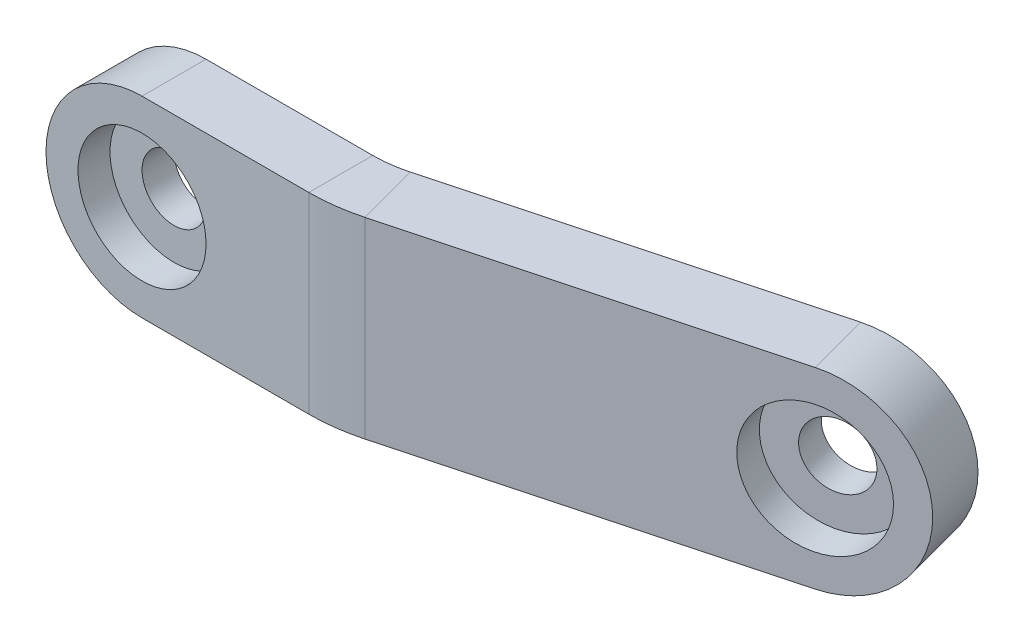
ISO-10303-21;
HEADER;
FILE_DESCRIPTION(('STEP AP214'),'2;1');
FILE_NAME('part.step','',(''),(''),'','','');
FILE_SCHEMA(('AUTOMOTIVE_DESIGN { 1 0 10303 214 1 1 1 1 }'));
ENDSEC;
DATA;
#1=APPLICATION_CONTEXT('core data for automotive mechanical design processes');
#2=APPLICATION_PROTOCOL_DEFINITION('international standard','automotive_design',2000,#1);
#3=PRODUCT_CONTEXT('',#1,'mechanical');
#4=PRODUCT('Part','Part','',(#3));
#5=PRODUCT_RELATED_PRODUCT_CATEGORY('part','',(#4));
#6=PRODUCT_DEFINITION_FORMATION('','',#4);
#7=PRODUCT_DEFINITION_CONTEXT('part definition',#1,'design');
#8=PRODUCT_DEFINITION('design','',#6,#7);
#9=PRODUCT_DEFINITION_SHAPE('','',#8);
#10=(LENGTH_UNIT() NAMED_UNIT(*) SI_UNIT(.MILLI.,.METRE.));
#11=(NAMED_UNIT(*) PLANE_ANGLE_UNIT() SI_UNIT($,.RADIAN.));
#12=(NAMED_UNIT(*) SI_UNIT($,.STERADIAN.) SOLID_ANGLE_UNIT());
#13=UNCERTAINTY_MEASURE_WITH_UNIT(LENGTH_MEASURE(1.E-05),#10,'distance_accuracy_value','');
#14=(GEOMETRIC_REPRESENTATION_CONTEXT(3) GLOBAL_UNCERTAINTY_ASSIGNED_CONTEXT((#13)) GLOBAL_UNIT_ASSIGNED_CONTEXT((#10,
#11,#12)) REPRESENTATION_CONTEXT('',''));
#15=CARTESIAN_POINT('',(0.,0.,0.));
#16=DIRECTION('',(0.,0.,1.));
#17=DIRECTION('',(1.,0.,0.));
#18=AXIS2_PLACEMENT_3D('',#15,#16,#17);
#19=CARTESIAN_POINT('',(19.2847768432247,0.,-13.5649973091008));
#20=DIRECTION('',(0.258819045102521,0.,0.965925826289068));
#21=DIRECTION('',(0.965925826289068,0.,-0.258819045102521));
#22=AXIS2_PLACEMENT_3D('',#19,#20,#21);
#23=CYLINDRICAL_SURFACE('',#22,2.5);
#24=CARTESIAN_POINT('',(20.8376911138399,0.,-7.76944235136641));
#25=DIRECTION('',(0.258819045102521,0.,0.965925826289068));
#26=DIRECTION('',(0.965925826289068,0.,-0.258819045102521));
#27=AXIS2_PLACEMENT_3D('',#24,#25,#26);
#28=CIRCLE('',#27,2.5);
#29=CARTESIAN_POINT('',(23.2525056795625,0.,-8.41648996412272));
#30=VERTEX_POINT('',#29);
#31=EDGE_CURVE('E206',#30,#30,#28,.T.);
#32=ORIENTED_EDGE('',*,*,#31,.F.);
#33=EDGE_LOOP('',(#32));
#34=FACE_BOUND('',#33,.T.);
#35=CARTESIAN_POINT('',(21.4847387265962,0.,-5.35462778564374));
#36=DIRECTION('',(0.258819045102521,0.,0.965925826289068));
#37=DIRECTION('',(0.965925826289068,0.,-0.258819045102521));
#38=AXIS2_PLACEMENT_3D('',#35,#36,#37);
#39=CIRCLE('',#38,2.5);
#40=CARTESIAN_POINT('',(23.8995532923188,0.,-6.00167539840004));
#41=VERTEX_POINT('',#40);
#42=EDGE_CURVE('E48',#41,#41,#39,.F.);
#43=ORIENTED_EDGE('',*,*,#42,.F.);
#44=EDGE_LOOP('',(#43));
#45=FACE_BOUND('',#44,.T.);
#46=ADVANCED_FACE('F44',(#34,#45),#23,.F.);
#47=CARTESIAN_POINT('',(-22.5,0.,-9.71058518963533));
#48=DIRECTION('',(0.,0.,1.));
#49=DIRECTION('',(1.,0.,0.));
#50=AXIS2_PLACEMENT_3D('',#47,#48,#49);
#51=CYLINDRICAL_SURFACE('',#50,2.5);
#52=CARTESIAN_POINT('',(-22.5,0.,0.));
#53=DIRECTION('',(0.,0.,1.));
#54=DIRECTION('',(1.,0.,0.));
#55=AXIS2_PLACEMENT_3D('',#52,#53,#54);
#56=CIRCLE('',#55,2.5);
#57=CARTESIAN_POINT('',(-20.,0.,0.));
#58=VERTEX_POINT('',#57);
#59=EDGE_CURVE('E193',#58,#58,#56,.T.);
#60=CARTESIAN_POINT('',(-22.5,0.,2.5));
#61=DIRECTION('',(0.,0.,1.));
#62=DIRECTION('',(1.,0.,0.));
#63=AXIS2_PLACEMENT_3D('',#60,#61,#62);
#64=CIRCLE('',#63,2.5);
#65=CARTESIAN_POINT('',(-20.,0.,2.5));
#66=VERTEX_POINT('',#65);
#67=EDGE_CURVE('E195',#66,#66,#64,.F.);
#68=CARTESIAN_POINT('',(-20.,0.,0.));
#69=CARTESIAN_POINT('',(-20.,0.,0.026041666666665));
#70=CARTESIAN_POINT('',(-20.,0.,0.0520833333333316));
#71=CARTESIAN_POINT('',(-20.,0.,0.104166666666665));
#72=CARTESIAN_POINT('',(-20.,0.,0.130208333333332));
#73=CARTESIAN_POINT('',(-20.,0.,0.182291666666665));
#74=CARTESIAN_POINT('',(-20.,0.,0.208333333333332));
#75=CARTESIAN_POINT('',(-20.,0.,0.260416666666665));
#76=CARTESIAN_POINT('',(-20.,0.,0.286458333333332));
#77=CARTESIAN_POINT('',(-20.,0.,0.338541666666665));
#78=CARTESIAN_POINT('',(-20.,0.,0.364583333333332));
#79=CARTESIAN_POINT('',(-20.,0.,0.416666666666665));
#80=CARTESIAN_POINT('',(-20.,0.,0.442708333333332));
#81=CARTESIAN_POINT('',(-20.,0.,0.494791666666665));
#82=CARTESIAN_POINT('',(-20.,0.,0.520833333333332));
#83=CARTESIAN_POINT('',(-20.,0.,0.572916666666666));
#84=CARTESIAN_POINT('',(-20.,0.,0.598958333333332));
#85=CARTESIAN_POINT('',(-20.,0.,0.651041666666666));
#86=CARTESIAN_POINT('',(-20.,0.,0.677083333333332));
#87=CARTESIAN_POINT('',(-20.,0.,0.729166666666666));
#88=CARTESIAN_POINT('',(-20.,0.,0.755208333333332));
#89=CARTESIAN_POINT('',(-20.,0.,0.807291666666666));
#90=CARTESIAN_POINT('',(-20.,0.,0.833333333333332));
#91=CARTESIAN_POINT('',(-20.,0.,0.885416666666666));
#92=CARTESIAN_POINT('',(-20.,0.,0.911458333333332));
#93=CARTESIAN_POINT('',(-20.,0.,0.963541666666666));
#94=CARTESIAN_POINT('',(-20.,0.,0.989583333333333));
#95=CARTESIAN_POINT('',(-20.,0.,1.04166666666667));
#96=CARTESIAN_POINT('',(-20.,0.,1.06770833333333));
#97=CARTESIAN_POINT('',(-20.,0.,1.11979166666667));
#98=CARTESIAN_POINT('',(-20.,0.,1.14583333333333));
#99=CARTESIAN_POINT('',(-20.,0.,1.19791666666667));
#100=CARTESIAN_POINT('',(-20.,0.,1.22395833333333));
#101=CARTESIAN_POINT('',(-20.,0.,1.27604166666667));
#102=CARTESIAN_POINT('',(-20.,0.,1.30208333333333));
#103=CARTESIAN_POINT('',(-20.,0.,1.35416666666667));
#104=CARTESIAN_POINT('',(-20.,0.,1.38020833333333));
#105=CARTESIAN_POINT('',(-20.,0.,1.43229166666667));
#106=CARTESIAN_POINT('',(-20.,0.,1.45833333333333));
#107=CARTESIAN_POINT('',(-20.,0.,1.51041666666667));
#108=CARTESIAN_POINT('',(-20.,0.,1.53645833333333));
#109=CARTESIAN_POINT('',(-20.,0.,1.58854166666667));
#110=CARTESIAN_POINT('',(-20.,0.,1.61458333333333));
#111=CARTESIAN_POINT('',(-20.,0.,1.66666666666667));
#112=CARTESIAN_POINT('',(-20.,0.,1.69270833333333));
#113=CARTESIAN_POINT('',(-20.,0.,1.74479166666667));
#114=CARTESIAN_POINT('',(-20.,0.,1.77083333333333));
#115=CARTESIAN_POINT('',(-20.,0.,1.82291666666667));
#116=CARTESIAN_POINT('',(-20.,0.,1.84895833333333));
#117=CARTESIAN_POINT('',(-20.,0.,1.90104166666667));
#118=CARTESIAN_POINT('',(-20.,0.,1.92708333333333));
#119=CARTESIAN_POINT('',(-20.,0.,1.97916666666667));
#120=CARTESIAN_POINT('',(-20.,0.,2.00520833333333));
#121=CARTESIAN_POINT('',(-20.,0.,2.05729166666667));
#122=CARTESIAN_POINT('',(-20.,0.,2.08333333333333));
#123=CARTESIAN_POINT('',(-20.,0.,2.13541666666667));
#124=CARTESIAN_POINT('',(-20.,0.,2.16145833333333));
#125=CARTESIAN_POINT('',(-20.,0.,2.21354166666667));
#126=CARTESIAN_POINT('',(-20.,0.,2.23958333333333));
#127=CARTESIAN_POINT('',(-20.,0.,2.29166666666667));
#128=CARTESIAN_POINT('',(-20.,0.,2.31770833333333));
#129=CARTESIAN_POINT('',(-20.,0.,2.36979166666667));
#130=CARTESIAN_POINT('',(-20.,0.,2.39583333333333));
#131=CARTESIAN_POINT('',(-20.,0.,2.44791666666667));
#132=CARTESIAN_POINT('',(-20.,0.,2.47395833333333));
#133=CARTESIAN_POINT('',(-20.,0.,2.5));
#134=B_SPLINE_CURVE_WITH_KNOTS('',3,(#68,#69,#70,#71,#72,#73,#74,#75,#76,#77,#78,#79,#80,#81,
#82,#83,#84,#85,#86,#87,#88,#89,#90,#91,#92,#93,#94,#95,#96,#97,#98,#99,#100,#101,#102,#103,
#104,#105,#106,#107,#108,#109,#110,#111,#112,#113,#114,#115,#116,#117,#118,#119,#120,#121,#122,
#123,#124,#125,#126,#127,#128,#129,#130,#131,#132,#133),.UNSPECIFIED.,.F.,.F.,(4,2,2,2,2,2,2,2,
2,2,2,2,2,2,2,2,2,2,2,2,2,2,2,2,2,2,2,2,2,2,2,2,4),(0.,0.0781250000000001,0.15625,0.234375,
0.3125,0.390625,0.46875,0.546875,0.625000000000001,0.703125000000001,0.781250000000001,
0.859375000000001,0.937500000000001,1.015625,1.09375,1.171875,1.25,1.328125,1.40625,1.484375,
1.5625,1.640625,1.71875,1.796875,1.875,1.953125,2.03125,2.109375,2.1875,2.265625,2.34375,
2.421875,2.5),.UNSPECIFIED.);
#135=EDGE_CURVE('BSEAM237',#58,#66,#134,.T.);
#136=ORIENTED_EDGE('',*,*,#59,.F.);
#137=ORIENTED_EDGE('',*,*,#67,.F.);
#138=ORIENTED_EDGE('',*,*,#135,.T.);
#139=ORIENTED_EDGE('',*,*,#135,.F.);
#140=EDGE_LOOP('',(#136,#138,#137,#139));
#141=FACE_BOUND('',#140,.T.);
#142=ADVANCED_FACE('F237',(#141),#51,.F.);
#143=CARTESIAN_POINT('',(-0.895639977664165,0.,-1.94601383655968));
#144=DIRECTION('',(0.258819045102521,0.,0.965925826289068));
#145=DIRECTION('',(0.965925826289068,0.,-0.258819045102521));
#146=AXIS2_PLACEMENT_3D('',#143,#144,#145);
#147=PLANE('',#146);
#148=ORIENTED_EDGE('',*,*,#31,.T.);
#149=EDGE_LOOP('',(#148));
#150=FACE_BOUND('',#149,.T.);
#151=DIRECTION('',(0.965925826289068,0.,-0.258819045102521));
#152=VECTOR('',#151,1.);
#153=CARTESIAN_POINT('',(-0.895639977664165,-7.50000000000001,-1.94601383655968));
#154=LINE('',#153,#152);
#155=CARTESIAN_POINT('',(-6.88659701278567,-7.50000000000001,-0.340741737109316));
#156=VERTEX_POINT('',#155);
#157=CARTESIAN_POINT('',(20.8376911138399,-7.5,-7.76944235136641));
#158=VERTEX_POINT('',#157);
#159=EDGE_CURVE('E61',#156,#158,#154,.T.);
#160=ORIENTED_EDGE('',*,*,#159,.F.);
#161=DIRECTION('',(0.,1.,0.));
#162=VECTOR('',#161,1.);
#163=CARTESIAN_POINT('',(-6.88659701278567,0.,-0.340741737109316));
#164=LINE('',#163,#162);
#165=CARTESIAN_POINT('',(-6.88659701278567,7.50000000000001,-0.340741737109316));
#166=VERTEX_POINT('',#165);
#167=EDGE_CURVE('E53',#156,#166,#164,.T.);
#168=ORIENTED_EDGE('',*,*,#167,.T.);
#169=DIRECTION('',(0.965925826289068,0.,-0.258819045102521));
#170=VECTOR('',#169,1.);
#171=CARTESIAN_POINT('',(-0.895639977664165,7.50000000000001,-1.94601383655968));
#172=LINE('',#171,#170);
#173=CARTESIAN_POINT('',(20.8376911138399,7.50000000000002,-7.76944235136641));
#174=VERTEX_POINT('',#173);
#175=EDGE_CURVE('E69',#166,#174,#172,.T.);
#176=ORIENTED_EDGE('',*,*,#175,.T.);
#177=CARTESIAN_POINT('',(20.8376911138399,0.,-7.76944235136641));
#178=DIRECTION('',(0.258819045102521,0.,0.965925826289068));
#179=DIRECTION('',(0.965925826289068,0.,-0.258819045102521));
#180=AXIS2_PLACEMENT_3D('',#177,#178,#179);
#181=CIRCLE('',#180,7.50000000000001);
#182=EDGE_CURVE('E147',#158,#174,#181,.T.);
#183=ORIENTED_EDGE('',*,*,#182,.F.);
#184=EDGE_LOOP('',(#160,#168,#176,#183));
#185=FACE_BOUND('',#184,.T.);
#186=ADVANCED_FACE('F217',(#150,#185),#147,.F.);
#187=CARTESIAN_POINT('',(0.39845524784844,7.50000000000001,2.88361529488566));
#188=DIRECTION('',(0.,-1.,0.));
#189=DIRECTION('',(0.965925826289068,0.,-0.258819045102521));
#190=AXIS2_PLACEMENT_3D('',#187,#188,#189);
#191=PLANE('',#190);
#192=DIRECTION('',(-0.258819045102521,0.,-0.965925826289068));
#193=VECTOR('',#192,1.);
#194=CARTESIAN_POINT('',(-5.59250178727307,7.50000000000001,4.48888739433603));
#195=LINE('',#194,#193);
#196=CARTESIAN_POINT('',(-5.59250178727307,7.50000000000001,4.48888739433602));
#197=VERTEX_POINT('',#196);
#198=EDGE_CURVE('E186',#197,#166,#195,.T.);
#199=ORIENTED_EDGE('',*,*,#198,.F.);
#200=DIRECTION('',(0.965925826289068,0.,-0.258819045102521));
#201=VECTOR('',#200,1.);
#202=CARTESIAN_POINT('',(0.39845524784844,7.50000000000001,2.88361529488566));
#203=LINE('',#202,#201);
#204=CARTESIAN_POINT('',(22.1317863393525,7.50000000000002,-2.93981321992107));
#205=VERTEX_POINT('',#204);
#206=EDGE_CURVE('E174',#197,#205,#203,.T.);
#207=ORIENTED_EDGE('',*,*,#206,.T.);
#208=DIRECTION('',(0.258819045102521,0.,0.965925826289068));
#209=VECTOR('',#208,1.);
#210=CARTESIAN_POINT('',(22.1317863393525,7.50000000000002,-2.93981321992107));
#211=LINE('',#210,#209);
#212=EDGE_CURVE('E178',#174,#205,#211,.T.);
#213=ORIENTED_EDGE('',*,*,#212,.F.);
#214=ORIENTED_EDGE('',*,*,#175,.F.);
#215=EDGE_LOOP('',(#199,#207,#213,#214));
#216=FACE_BOUND('',#215,.T.);
#217=ADVANCED_FACE('F220',(#216),#191,.F.);
#218=CARTESIAN_POINT('',(0.398455247848443,-7.5,2.88361529488566));
#219=DIRECTION('',(0.,-1.,0.));
#220=DIRECTION('',(0.965925826289068,0.,-0.258819045102521));
#221=AXIS2_PLACEMENT_3D('',#218,#219,#220);
#222=PLANE('',#221);
#223=DIRECTION('',(0.258819045102521,0.,0.965925826289068));
#224=VECTOR('',#223,1.);
#225=CARTESIAN_POINT('',(-5.59250178727307,-7.50000000000001,4.48888739433602));
#226=LINE('',#225,#224);
#227=CARTESIAN_POINT('',(-5.59250178727307,-7.50000000000001,4.48888739433603));
#228=VERTEX_POINT('',#227);
#229=EDGE_CURVE('E12',#156,#228,#226,.T.);
#230=ORIENTED_EDGE('',*,*,#229,.F.);
#231=ORIENTED_EDGE('',*,*,#159,.T.);
#232=DIRECTION('',(0.258819045102521,0.,0.965925826289068));
#233=VECTOR('',#232,1.);
#234=CARTESIAN_POINT('',(22.1317863393525,-7.5,-2.93981321992107));
#235=LINE('',#234,#233);
#236=CARTESIAN_POINT('',(22.1317863393525,-7.5,-2.93981321992107));
#237=VERTEX_POINT('',#236);
#238=EDGE_CURVE('E182',#158,#237,#235,.T.);
#239=ORIENTED_EDGE('',*,*,#238,.T.);
#240=DIRECTION('',(0.965925826289068,0.,-0.258819045102521));
#241=VECTOR('',#240,1.);
#242=CARTESIAN_POINT('',(0.398455247848443,-7.5,2.88361529488566));
#243=LINE('',#242,#241);
#244=EDGE_CURVE('E175',#228,#237,#243,.T.);
#245=ORIENTED_EDGE('',*,*,#244,.F.);
#246=EDGE_LOOP('',(#230,#231,#239,#245));
#247=FACE_BOUND('',#246,.T.);
#248=ADVANCED_FACE('F46',(#247),#222,.T.);
#249=CARTESIAN_POINT('',(22.1317863393525,0.,-2.93981321992107));
#250=DIRECTION('',(0.258819045102521,0.,0.965925826289068));
#251=DIRECTION('',(0.965925826289068,0.,-0.258819045102521));
#252=AXIS2_PLACEMENT_3D('',#249,#250,#251);
#253=CYLINDRICAL_SURFACE('',#252,7.50000000000001);
#254=ORIENTED_EDGE('',*,*,#182,.T.);
#255=ORIENTED_EDGE('',*,*,#212,.T.);
#256=CARTESIAN_POINT('',(22.1317863393525,0.,-2.93981321992107));
#257=DIRECTION('',(0.258819045102521,0.,0.965925826289068));
#258=DIRECTION('',(0.965925826289068,0.,-0.258819045102521));
#259=AXIS2_PLACEMENT_3D('',#256,#257,#258);
#260=CIRCLE('',#259,7.50000000000001);
#261=EDGE_CURVE('E171',#237,#205,#260,.T.);
#262=ORIENTED_EDGE('',*,*,#261,.F.);
#263=ORIENTED_EDGE('',*,*,#238,.F.);
#264=EDGE_LOOP('',(#254,#255,#262,#263));
#265=FACE_BOUND('',#264,.T.);
#266=ADVANCED_FACE('F227',(#265),#253,.T.);
#267=CARTESIAN_POINT('',(0.398455247848442,0.,2.88361529488566));
#268=DIRECTION('',(0.258819045102521,0.,0.965925826289068));
#269=DIRECTION('',(0.965925826289068,0.,-0.258819045102521));
#270=AXIS2_PLACEMENT_3D('',#267,#268,#269);
#271=PLANE('',#270);
#272=CARTESIAN_POINT('',(22.1317863393525,0.,-2.93981321992107));
#273=DIRECTION('',(0.258819045102521,0.,0.965925826289068));
#274=DIRECTION('',(0.965925826289068,0.,-0.258819045102521));
#275=AXIS2_PLACEMENT_3D('',#272,#273,#274);
#276=CIRCLE('',#275,5.);
#277=CARTESIAN_POINT('',(26.9614154707978,0.,-4.23390844543368));
#278=VERTEX_POINT('',#277);
#279=EDGE_CURVE('E296',#278,#278,#276,.T.);
#280=ORIENTED_EDGE('',*,*,#279,.F.);
#281=EDGE_LOOP('',(#280));
#282=FACE_BOUND('',#281,.T.);
#283=DIRECTION('',(0.,1.,0.));
#284=VECTOR('',#283,1.);
#285=CARTESIAN_POINT('',(-5.59250178727307,0.,4.48888739433603));
#286=LINE('',#285,#284);
#287=EDGE_CURVE('E181',#228,#197,#286,.T.);
#288=ORIENTED_EDGE('',*,*,#287,.F.);
#289=ORIENTED_EDGE('',*,*,#244,.T.);
#290=ORIENTED_EDGE('',*,*,#261,.T.);
#291=ORIENTED_EDGE('',*,*,#206,.F.);
#292=EDGE_LOOP('',(#288,#289,#290,#291));
#293=FACE_BOUND('',#292,.T.);
#294=ADVANCED_FACE('F222',(#282,#293),#271,.T.);
#295=CARTESIAN_POINT('',(-22.5,0.,5.));
#296=DIRECTION('',(0.,0.,1.));
#297=DIRECTION('',(1.,0.,0.));
#298=AXIS2_PLACEMENT_3D('',#295,#296,#297);
#299=CYLINDRICAL_SURFACE('',#298,7.50000000000001);
#300=DIRECTION('',(0.,0.,1.));
#301=VECTOR('',#300,1.);
#302=CARTESIAN_POINT('',(-22.5,7.50000000000001,5.));
#303=LINE('',#302,#301);
#304=CARTESIAN_POINT('',(-22.5,7.50000000000001,0.));
#305=VERTEX_POINT('',#304);
#306=CARTESIAN_POINT('',(-22.5,7.50000000000001,5.));
#307=VERTEX_POINT('',#306);
#308=EDGE_CURVE('E157',#305,#307,#303,.T.);
#309=ORIENTED_EDGE('',*,*,#308,.F.);
#310=CARTESIAN_POINT('',(-22.5,0.,0.));
#311=DIRECTION('',(0.,0.,1.));
#312=DIRECTION('',(1.,0.,0.));
#313=AXIS2_PLACEMENT_3D('',#310,#311,#312);
#314=CIRCLE('',#313,7.50000000000001);
#315=CARTESIAN_POINT('',(-22.5,-7.50000000000001,0.));
#316=VERTEX_POINT('',#315);
#317=EDGE_CURVE('E166',#305,#316,#314,.T.);
#318=ORIENTED_EDGE('',*,*,#317,.T.);
#319=DIRECTION('',(0.,0.,1.));
#320=VECTOR('',#319,1.);
#321=CARTESIAN_POINT('',(-22.5,-7.50000000000001,5.));
#322=LINE('',#321,#320);
#323=CARTESIAN_POINT('',(-22.5,-7.50000000000001,5.));
#324=VERTEX_POINT('',#323);
#325=EDGE_CURVE('E139',#316,#324,#322,.T.);
#326=ORIENTED_EDGE('',*,*,#325,.T.);
#327=CARTESIAN_POINT('',(-22.5,0.,5.));
#328=DIRECTION('',(0.,0.,1.));
#329=DIRECTION('',(1.,0.,0.));
#330=AXIS2_PLACEMENT_3D('',#327,#328,#329);
#331=CIRCLE('',#330,7.50000000000001);
#332=EDGE_CURVE('E131',#307,#324,#331,.T.);
#333=ORIENTED_EDGE('',*,*,#332,.F.);
#334=EDGE_LOOP('',(#309,#318,#326,#333));
#335=FACE_BOUND('',#334,.T.);
#336=ADVANCED_FACE('F267',(#335),#299,.T.);
#337=CARTESIAN_POINT('',(0.,0.,5.));
#338=DIRECTION('',(0.,0.,1.));
#339=DIRECTION('',(1.,0.,0.));
#340=AXIS2_PLACEMENT_3D('',#337,#338,#339);
#341=PLANE('',#340);
#342=CARTESIAN_POINT('',(-22.5,0.,5.));
#343=DIRECTION('',(0.,0.,1.));
#344=DIRECTION('',(1.,0.,0.));
#345=AXIS2_PLACEMENT_3D('',#342,#343,#344);
#346=CIRCLE('',#345,5.);
#347=CARTESIAN_POINT('',(-17.5,0.,5.));
#348=VERTEX_POINT('',#347);
#349=EDGE_CURVE('E201',#348,#348,#346,.T.);
#350=ORIENTED_EDGE('',*,*,#349,.F.);
#351=EDGE_LOOP('',(#350));
#352=FACE_BOUND('',#351,.T.);
#353=DIRECTION('',(1.,0.,0.));
#354=VECTOR('',#353,1.);
#355=CARTESIAN_POINT('',(0.,-7.50000000000001,5.));
#356=LINE('',#355,#354);
#357=CARTESIAN_POINT('',(-9.47478746381089,-7.50000000000001,5.));
#358=VERTEX_POINT('',#357);
#359=EDGE_CURVE('E132',#324,#358,#356,.T.);
#360=ORIENTED_EDGE('',*,*,#359,.T.);
#361=DIRECTION('',(0.,1.,0.));
#362=VECTOR('',#361,1.);
#363=CARTESIAN_POINT('',(-9.47478746381089,0.,5.));
#364=LINE('',#363,#362);
#365=CARTESIAN_POINT('',(-9.47478746381089,7.50000000000001,5.));
#366=VERTEX_POINT('',#365);
#367=EDGE_CURVE('E124',#358,#366,#364,.T.);
#368=ORIENTED_EDGE('',*,*,#367,.T.);
#369=DIRECTION('',(1.,0.,0.));
#370=VECTOR('',#369,1.);
#371=CARTESIAN_POINT('',(0.,7.50000000000001,5.));
#372=LINE('',#371,#370);
#373=EDGE_CURVE('E162',#307,#366,#372,.T.);
#374=ORIENTED_EDGE('',*,*,#373,.F.);
#375=ORIENTED_EDGE('',*,*,#332,.T.);
#376=EDGE_LOOP('',(#360,#368,#374,#375));
#377=FACE_BOUND('',#376,.T.);
#378=ADVANCED_FACE('F136',(#352,#377),#341,.T.);
#379=CARTESIAN_POINT('',(0.,7.50000000000001,5.));
#380=DIRECTION('',(0.,-1.,0.));
#381=DIRECTION('',(1.,0.,0.));
#382=AXIS2_PLACEMENT_3D('',#379,#380,#381);
#383=PLANE('',#382);
#384=ORIENTED_EDGE('',*,*,#373,.T.);
#385=DIRECTION('',(0.,0.,-1.));
#386=VECTOR('',#385,1.);
#387=CARTESIAN_POINT('',(-9.47478746381089,7.50000000000001,5.));
#388=LINE('',#387,#386);
#389=CARTESIAN_POINT('',(-9.47478746381089,7.50000000000001,0.));
#390=VERTEX_POINT('',#389);
#391=EDGE_CURVE('E159',#366,#390,#388,.T.);
#392=ORIENTED_EDGE('',*,*,#391,.T.);
#393=DIRECTION('',(1.,0.,0.));
#394=VECTOR('',#393,1.);
#395=CARTESIAN_POINT('',(0.,7.50000000000001,0.));
#396=LINE('',#395,#394);
#397=EDGE_CURVE('E149',#305,#390,#396,.T.);
#398=ORIENTED_EDGE('',*,*,#397,.F.);
#399=ORIENTED_EDGE('',*,*,#308,.T.);
#400=EDGE_LOOP('',(#384,#392,#398,#399));
#401=FACE_BOUND('',#400,.T.);
#402=ADVANCED_FACE('F273',(#401),#383,.F.);
#403=CARTESIAN_POINT('',(0.,0.,0.));
#404=DIRECTION('',(0.,0.,1.));
#405=DIRECTION('',(1.,0.,0.));
#406=AXIS2_PLACEMENT_3D('',#403,#404,#405);
#407=PLANE('',#406);
#408=ORIENTED_EDGE('',*,*,#59,.T.);
#409=EDGE_LOOP('',(#408));
#410=FACE_BOUND('',#409,.T.);
#411=DIRECTION('',(0.,1.,0.));
#412=VECTOR('',#411,1.);
#413=CARTESIAN_POINT('',(-9.47478746381089,0.,0.));
#414=LINE('',#413,#412);
#415=CARTESIAN_POINT('',(-9.47478746381089,-7.50000000000001,0.));
#416=VERTEX_POINT('',#415);
#417=EDGE_CURVE('E169',#416,#390,#414,.T.);
#418=ORIENTED_EDGE('',*,*,#417,.F.);
#419=DIRECTION('',(1.,0.,0.));
#420=VECTOR('',#419,1.);
#421=CARTESIAN_POINT('',(0.,-7.50000000000001,0.));
#422=LINE('',#421,#420);
#423=EDGE_CURVE('E144',#316,#416,#422,.T.);
#424=ORIENTED_EDGE('',*,*,#423,.F.);
#425=ORIENTED_EDGE('',*,*,#317,.F.);
#426=ORIENTED_EDGE('',*,*,#397,.T.);
#427=EDGE_LOOP('',(#418,#424,#425,#426));
#428=FACE_BOUND('',#427,.T.);
#429=ADVANCED_FACE('F277',(#410,#428),#407,.F.);
#430=CARTESIAN_POINT('',(0.,-7.50000000000001,5.));
#431=DIRECTION('',(0.,-1.,0.));
#432=DIRECTION('',(1.,0.,0.));
#433=AXIS2_PLACEMENT_3D('',#430,#431,#432);
#434=PLANE('',#433);
#435=ORIENTED_EDGE('',*,*,#423,.T.);
#436=DIRECTION('',(0.,0.,1.));
#437=VECTOR('',#436,1.);
#438=CARTESIAN_POINT('',(-9.47478746381089,-7.50000000000001,5.));
#439=LINE('',#438,#437);
#440=EDGE_CURVE('E115',#416,#358,#439,.T.);
#441=ORIENTED_EDGE('',*,*,#440,.T.);
#442=ORIENTED_EDGE('',*,*,#359,.F.);
#443=ORIENTED_EDGE('',*,*,#325,.F.);
#444=EDGE_LOOP('',(#435,#441,#442,#443));
#445=FACE_BOUND('',#444,.T.);
#446=ADVANCED_FACE('F142',(#445),#434,.T.);
#447=CARTESIAN_POINT('',(-9.47478746381089,-7.50000000000001,-10.));
#448=DIRECTION('',(0.,-1.,0.));
#449=DIRECTION('',(0.,0.,-1.));
#450=AXIS2_PLACEMENT_3D('',#447,#448,#449);
#451=PLANE('',#450);
#452=ORIENTED_EDGE('',*,*,#440,.F.);
#453=CARTESIAN_POINT('',(-9.47478746381089,-7.50000000000001,-10.));
#454=DIRECTION('',(0.,1.,0.));
#455=DIRECTION('',(-1.,0.,0.));
#456=AXIS2_PLACEMENT_3D('',#453,#454,#455);
#457=CIRCLE('',#456,10.);
#458=EDGE_CURVE('E152',#416,#156,#457,.T.);
#459=ORIENTED_EDGE('',*,*,#458,.T.);
#460=ORIENTED_EDGE('',*,*,#229,.T.);
#461=CARTESIAN_POINT('',(-9.47478746381089,-7.50000000000001,-10.));
#462=DIRECTION('',(0.,1.,0.));
#463=DIRECTION('',(0.,0.,1.));
#464=AXIS2_PLACEMENT_3D('',#461,#462,#463);
#465=CIRCLE('',#464,15.);
#466=EDGE_CURVE('E110',#358,#228,#465,.T.);
#467=ORIENTED_EDGE('',*,*,#466,.F.);
#468=EDGE_LOOP('',(#452,#459,#460,#467));
#469=FACE_BOUND('',#468,.T.);
#470=ADVANCED_FACE('F112',(#469),#451,.T.);
#471=CARTESIAN_POINT('',(-9.47478746381089,7.50000000000001,-10.));
#472=DIRECTION('',(0.,1.,0.));
#473=DIRECTION('',(0.,0.,1.));
#474=AXIS2_PLACEMENT_3D('',#471,#472,#473);
#475=PLANE('',#474);
#476=ORIENTED_EDGE('',*,*,#198,.T.);
#477=CARTESIAN_POINT('',(-9.47478746381089,7.50000000000001,-10.));
#478=DIRECTION('',(0.,1.,0.));
#479=DIRECTION('',(-1.,0.,0.));
#480=AXIS2_PLACEMENT_3D('',#477,#478,#479);
#481=CIRCLE('',#480,10.);
#482=EDGE_CURVE('E120',#166,#390,#481,.F.);
#483=ORIENTED_EDGE('',*,*,#482,.T.);
#484=ORIENTED_EDGE('',*,*,#391,.F.);
#485=CARTESIAN_POINT('',(-9.47478746381089,7.50000000000001,-10.));
#486=DIRECTION('',(0.,-1.,0.));
#487=DIRECTION('',(0.,0.,1.));
#488=AXIS2_PLACEMENT_3D('',#485,#486,#487);
#489=CIRCLE('',#488,15.);
#490=EDGE_CURVE('E119',#197,#366,#489,.T.);
#491=ORIENTED_EDGE('',*,*,#490,.F.);
#492=EDGE_LOOP('',(#476,#483,#484,#491));
#493=FACE_BOUND('',#492,.T.);
#494=ADVANCED_FACE('F218',(#493),#475,.T.);
#495=CARTESIAN_POINT('',(-9.47478746381089,-16.146492069932,-10.));
#496=DIRECTION('',(0.,1.,0.));
#497=DIRECTION('',(-1.,0.,0.));
#498=AXIS2_PLACEMENT_3D('',#495,#496,#497);
#499=CYLINDRICAL_SURFACE('',#498,15.);
#500=ORIENTED_EDGE('',*,*,#490,.T.);
#501=ORIENTED_EDGE('',*,*,#367,.F.);
#502=ORIENTED_EDGE('',*,*,#466,.T.);
#503=ORIENTED_EDGE('',*,*,#287,.T.);
#504=EDGE_LOOP('',(#500,#501,#502,#503));
#505=FACE_BOUND('',#504,.T.);
#506=ADVANCED_FACE('F126',(#505),#499,.T.);
#507=CARTESIAN_POINT('',(-9.47478746381089,-16.146492069932,-10.));
#508=DIRECTION('',(0.,1.,0.));
#509=DIRECTION('',(-1.,0.,0.));
#510=AXIS2_PLACEMENT_3D('',#507,#508,#509);
#511=CYLINDRICAL_SURFACE('',#510,10.);
#512=ORIENTED_EDGE('',*,*,#482,.F.);
#513=ORIENTED_EDGE('',*,*,#167,.F.);
#514=ORIENTED_EDGE('',*,*,#458,.F.);
#515=ORIENTED_EDGE('',*,*,#417,.T.);
#516=EDGE_LOOP('',(#512,#513,#514,#515));
#517=FACE_BOUND('',#516,.T.);
#518=ADVANCED_FACE('F216',(#517),#511,.F.);
#519=CARTESIAN_POINT('',(-22.5,0.,2.5));
#520=DIRECTION('',(0.,0.,1.));
#521=DIRECTION('',(1.,0.,0.));
#522=AXIS2_PLACEMENT_3D('',#519,#520,#521);
#523=PLANE('',#522);
#524=CARTESIAN_POINT('',(-22.5,0.,2.5));
#525=DIRECTION('',(0.,0.,1.));
#526=DIRECTION('',(1.,0.,0.));
#527=AXIS2_PLACEMENT_3D('',#524,#525,#526);
#528=CIRCLE('',#527,5.);
#529=CARTESIAN_POINT('',(-17.5,0.,2.5));
#530=VERTEX_POINT('',#529);
#531=EDGE_CURVE('E197',#530,#530,#528,.T.);
#532=ORIENTED_EDGE('',*,*,#531,.T.);
#533=EDGE_LOOP('',(#532));
#534=FACE_BOUND('',#533,.T.);
#535=ORIENTED_EDGE('',*,*,#67,.T.);
#536=EDGE_LOOP('',(#535));
#537=FACE_BOUND('',#536,.T.);
#538=ADVANCED_FACE('F251',(#534,#537),#523,.T.);
#539=CARTESIAN_POINT('',(-22.5,0.,2.5));
#540=DIRECTION('',(0.,0.,1.));
#541=DIRECTION('',(1.,0.,0.));
#542=AXIS2_PLACEMENT_3D('',#539,#540,#541);
#543=CYLINDRICAL_SURFACE('',#542,5.);
#544=ORIENTED_EDGE('',*,*,#531,.F.);
#545=EDGE_LOOP('',(#544));
#546=FACE_BOUND('',#545,.T.);
#547=ORIENTED_EDGE('',*,*,#349,.T.);
#548=EDGE_LOOP('',(#547));
#549=FACE_BOUND('',#548,.T.);
#550=ADVANCED_FACE('F254',(#546,#549),#543,.F.);
#551=CARTESIAN_POINT('',(21.4847387265962,0.,-5.35462778564374));
#552=DIRECTION('',(0.258819045102521,0.,0.965925826289068));
#553=DIRECTION('',(0.965925826289068,0.,-0.258819045102521));
#554=AXIS2_PLACEMENT_3D('',#551,#552,#553);
#555=PLANE('',#554);
#556=CARTESIAN_POINT('',(21.4847387265962,0.,-5.35462778564374));
#557=DIRECTION('',(0.258819045102521,0.,0.965925826289068));
#558=DIRECTION('',(0.965925826289068,0.,-0.258819045102521));
#559=AXIS2_PLACEMENT_3D('',#556,#557,#558);
#560=CIRCLE('',#559,5.);
#561=CARTESIAN_POINT('',(26.3143678580415,0.,-6.64872301115635));
#562=VERTEX_POINT('',#561);
#563=EDGE_CURVE('E292',#562,#562,#560,.T.);
#564=ORIENTED_EDGE('',*,*,#563,.T.);
#565=EDGE_LOOP('',(#564));
#566=FACE_BOUND('',#565,.T.);
#567=ORIENTED_EDGE('',*,*,#42,.T.);
#568=EDGE_LOOP('',(#567));
#569=FACE_BOUND('',#568,.T.);
#570=ADVANCED_FACE('F256',(#566,#569),#555,.T.);
#571=CARTESIAN_POINT('',(21.4847387265962,0.,-5.35462778564374));
#572=DIRECTION('',(0.258819045102521,0.,0.965925826289068));
#573=DIRECTION('',(0.965925826289068,0.,-0.258819045102521));
#574=AXIS2_PLACEMENT_3D('',#571,#572,#573);
#575=CYLINDRICAL_SURFACE('',#574,5.);
#576=ORIENTED_EDGE('',*,*,#563,.F.);
#577=EDGE_LOOP('',(#576));
#578=FACE_BOUND('',#577,.T.);
#579=ORIENTED_EDGE('',*,*,#279,.T.);
#580=EDGE_LOOP('',(#579));
#581=FACE_BOUND('',#580,.T.);
#582=ADVANCED_FACE('F249',(#578,#581),#575,.F.);
#583=CLOSED_SHELL('',(#46,#142,#186,#217,#248,#266,#294,#336,#378,#402,#429,#446,#470,#494,#506,
#518,#538,#550,#570,#582));
#584=MANIFOLD_SOLID_BREP('B2',#583);
#585=ADVANCED_BREP_SHAPE_REPRESENTATION('',(#18,#584),#14);
#586=SHAPE_DEFINITION_REPRESENTATION(#9,#585);
ENDSEC;
END-ISO-10303-21;
